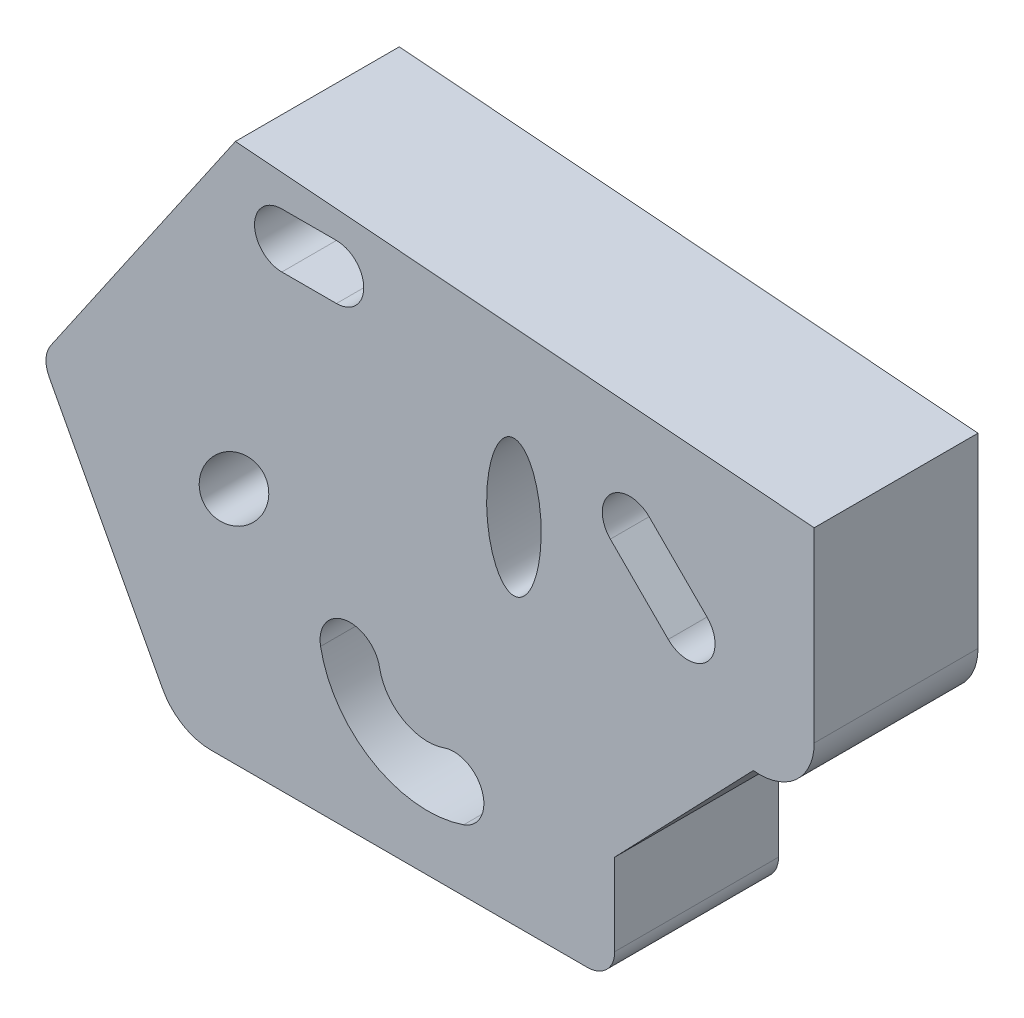
ISO-10303-21;
HEADER;
FILE_DESCRIPTION(('STEP AP214'),'2;1');
FILE_NAME('part.step','',(''),(''),'','','');
FILE_SCHEMA(('AUTOMOTIVE_DESIGN { 1 0 10303 214 1 1 1 1 }'));
ENDSEC;
DATA;
#1=APPLICATION_CONTEXT('core data for automotive mechanical design processes');
#2=APPLICATION_PROTOCOL_DEFINITION('international standard','automotive_design',2000,#1);
#3=PRODUCT_CONTEXT('',#1,'mechanical');
#4=PRODUCT('Part','Part','',(#3));
#5=PRODUCT_RELATED_PRODUCT_CATEGORY('part','',(#4));
#6=PRODUCT_DEFINITION_FORMATION('','',#4);
#7=PRODUCT_DEFINITION_CONTEXT('part definition',#1,'design');
#8=PRODUCT_DEFINITION('design','',#6,#7);
#9=PRODUCT_DEFINITION_SHAPE('','',#8);
#10=(LENGTH_UNIT() NAMED_UNIT(*) SI_UNIT(.MILLI.,.METRE.));
#11=(NAMED_UNIT(*) PLANE_ANGLE_UNIT() SI_UNIT($,.RADIAN.));
#12=(NAMED_UNIT(*) SI_UNIT($,.STERADIAN.) SOLID_ANGLE_UNIT());
#13=UNCERTAINTY_MEASURE_WITH_UNIT(LENGTH_MEASURE(1.E-05),#10,'distance_accuracy_value','');
#14=(GEOMETRIC_REPRESENTATION_CONTEXT(3) GLOBAL_UNCERTAINTY_ASSIGNED_CONTEXT((#13)) GLOBAL_UNIT_ASSIGNED_CONTEXT((#10,
#11,#12)) REPRESENTATION_CONTEXT('',''));
#15=CARTESIAN_POINT('',(0.,0.,0.));
#16=DIRECTION('',(0.,0.,1.));
#17=DIRECTION('',(1.,0.,0.));
#18=AXIS2_PLACEMENT_3D('',#15,#16,#17);
#19=CARTESIAN_POINT('',(192.,-84.8497782754737,0.));
#20=DIRECTION('',(0.,0.,-1.));
#21=DIRECTION('',(-1.,0.,0.));
#22=AXIS2_PLACEMENT_3D('',#19,#20,#21);
#23=PLANE('',#22);
#24=CARTESIAN_POINT('',(70.4570944777884,-137.244425918757,0.));
#25=DIRECTION('',(0.,0.,1.));
#26=DIRECTION('',(1.,0.,0.));
#27=AXIS2_PLACEMENT_3D('',#24,#25,#26);
#28=CIRCLE('',#27,17.9528625932525);
#29=CARTESIAN_POINT('',(52.8116438658685,-140.552499073102,0.));
#30=VERTEX_POINT('',#29);
#31=CARTESIAN_POINT('',(76.3743840386687,-154.194085488934,0.));
#32=VERTEX_POINT('',#31);
#33=EDGE_CURVE('E958',#30,#32,#28,.T.);
#34=ORIENTED_EDGE('',*,*,#33,.F.);
#35=CARTESIAN_POINT('',(42.,-142.579407289482,0.));
#36=DIRECTION('',(0.,0.,1.));
#37=DIRECTION('',(1.,0.,0.));
#38=AXIS2_PLACEMENT_3D('',#35,#36,#37);
#39=CIRCLE('',#38,11.);
#40=CARTESIAN_POINT('',(31.1883561341315,-144.606315505862,0.));
#41=VERTEX_POINT('',#40);
#42=EDGE_CURVE('E266',#30,#41,#39,.T.);
#43=ORIENTED_EDGE('',*,*,#42,.T.);
#44=CARTESIAN_POINT('',(70.4570944777884,-137.244425918757,0.));
#45=DIRECTION('',(0.,0.,1.));
#46=DIRECTION('',(1.,0.,0.));
#47=AXIS2_PLACEMENT_3D('',#44,#45,#46);
#48=CIRCLE('',#47,39.9528625932525);
#49=CARTESIAN_POINT('',(83.6256159613313,-174.96472909003,0.));
#50=VERTEX_POINT('',#49);
#51=EDGE_CURVE('E413',#41,#50,#48,.T.);
#52=ORIENTED_EDGE('',*,*,#51,.T.);
#53=CARTESIAN_POINT('',(80.,-164.579407289482,0.));
#54=DIRECTION('',(0.,0.,1.));
#55=DIRECTION('',(1.,0.,0.));
#56=AXIS2_PLACEMENT_3D('',#53,#54,#55);
#57=CIRCLE('',#56,11.);
#58=EDGE_CURVE('E962',#50,#32,#57,.T.);
#59=ORIENTED_EDGE('',*,*,#58,.T.);
#60=EDGE_LOOP('',(#34,#43,#52,#59));
#61=FACE_BOUND('',#60,.T.);
#62=DIRECTION('',(0.70710678118655,-0.707106781186545,0.));
#63=VECTOR('',#62,1.);
#64=CARTESIAN_POINT('',(151.527534094166,-43.2927201392493,0.));
#65=LINE('',#64,#63);
#66=CARTESIAN_POINT('',(151.527534094166,-43.2927201392493,0.));
#67=VERTEX_POINT('',#66);
#68=CARTESIAN_POINT('',(172.740737529763,-64.5059235748457,0.));
#69=VERTEX_POINT('',#68);
#70=EDGE_CURVE('E931',#67,#69,#65,.T.);
#71=ORIENTED_EDGE('',*,*,#70,.F.);
#72=CARTESIAN_POINT('',(144.426406871193,-50.3938473622226,0.));
#73=DIRECTION('',(0.,0.,1.));
#74=DIRECTION('',(1.,0.,0.));
#75=AXIS2_PLACEMENT_3D('',#72,#73,#74);
#76=CIRCLE('',#75,10.0425104268655);
#77=CARTESIAN_POINT('',(137.32527964822,-57.4949745851957,0.));
#78=VERTEX_POINT('',#77);
#79=EDGE_CURVE('E274',#67,#78,#76,.T.);
#80=ORIENTED_EDGE('',*,*,#79,.T.);
#81=DIRECTION('',(0.707106781186549,-0.707106781186546,0.));
#82=VECTOR('',#81,1.);
#83=CARTESIAN_POINT('',(137.32527964822,-57.4949745851957,0.));
#84=LINE('',#83,#82);
#85=CARTESIAN_POINT('',(158.538483083816,-78.7081780207921,0.));
#86=VERTEX_POINT('',#85);
#87=EDGE_CURVE('E941',#78,#86,#84,.T.);
#88=ORIENTED_EDGE('',*,*,#87,.T.);
#89=CARTESIAN_POINT('',(165.639610306789,-71.6070507978189,0.));
#90=DIRECTION('',(0.,0.,1.));
#91=DIRECTION('',(1.,0.,0.));
#92=AXIS2_PLACEMENT_3D('',#89,#90,#91);
#93=CIRCLE('',#92,10.0425104268655);
#94=EDGE_CURVE('E938',#86,#69,#93,.T.);
#95=ORIENTED_EDGE('',*,*,#94,.T.);
#96=EDGE_LOOP('',(#71,#80,#88,#95));
#97=FACE_BOUND('',#96,.T.);
#98=CARTESIAN_POINT('',(102.,-68.1502074204967,0.));
#99=DIRECTION('',(0.,0.,1.));
#100=DIRECTION('',(0.,-1.,0.));
#101=AXIS2_PLACEMENT_3D('',#98,#99,#100);
#102=ELLIPSE('',#101,25.,9.99999999999999);
#103=CARTESIAN_POINT('',(102.,-93.1502074204967,0.));
#104=VERTEX_POINT('',#103);
#105=EDGE_CURVE('E570',#104,#104,#102,.T.);
#106=ORIENTED_EDGE('',*,*,#105,.T.);
#107=EDGE_LOOP('',(#106));
#108=FACE_BOUND('',#107,.T.);
#109=DIRECTION('',(0.565923248781696,0.824457928877133,0.));
#110=VECTOR('',#109,1.);
#111=CARTESIAN_POINT('',(-67.6368287505263,-98.5358347930092,0.));
#112=LINE('',#111,#110);
#113=CARTESIAN_POINT('',(-67.6368287505263,-98.5358347930092,0.));
#114=VERTEX_POINT('',#113);
#115=CARTESIAN_POINT('',(0.,0.,0.));
#116=VERTEX_POINT('',#115);
#117=EDGE_CURVE('E604',#114,#116,#112,.T.);
#118=ORIENTED_EDGE('',*,*,#117,.T.);
#119=DIRECTION('',(0.996963135149948,-0.077874945598605,0.));
#120=VECTOR('',#119,1.);
#121=CARTESIAN_POINT('',(0.,0.,0.));
#122=LINE('',#121,#120);
#123=CARTESIAN_POINT('',(212.,-16.5597782754737,0.));
#124=VERTEX_POINT('',#123);
#125=EDGE_CURVE('E608',#116,#124,#122,.T.);
#126=ORIENTED_EDGE('',*,*,#125,.T.);
#127=DIRECTION('',(0.,-1.,0.));
#128=VECTOR('',#127,1.);
#129=CARTESIAN_POINT('',(212.,-16.5597782754737,0.));
#130=LINE('',#129,#128);
#131=CARTESIAN_POINT('',(212.,-84.8497782754737,0.));
#132=VERTEX_POINT('',#131);
#133=EDGE_CURVE('E612',#124,#132,#130,.T.);
#134=ORIENTED_EDGE('',*,*,#133,.T.);
#135=CARTESIAN_POINT('',(192.,-84.8497782754737,0.));
#136=DIRECTION('',(0.,0.,-1.));
#137=DIRECTION('',(-1.,0.,0.));
#138=AXIS2_PLACEMENT_3D('',#135,#136,#137);
#139=CIRCLE('',#138,20.0000000000001);
#140=CARTESIAN_POINT('',(189.699474867549,-104.717027307863,0.));
#141=VERTEX_POINT('',#140);
#142=EDGE_CURVE('E616',#132,#141,#139,.T.);
#143=ORIENTED_EDGE('',*,*,#142,.T.);
#144=DIRECTION('',(-0.692646888854,-0.721276845157859,0.));
#145=VECTOR('',#144,1.);
#146=CARTESIAN_POINT('',(189.699474867549,-104.717027307863,0.));
#147=LINE('',#146,#145);
#148=CARTESIAN_POINT('',(138.935384383439,-157.579407289482,0.));
#149=VERTEX_POINT('',#148);
#150=EDGE_CURVE('E620',#141,#149,#147,.T.);
#151=ORIENTED_EDGE('',*,*,#150,.T.);
#152=DIRECTION('',(0.,-1.,0.));
#153=VECTOR('',#152,1.);
#154=CARTESIAN_POINT('',(138.935384383439,-157.579407289482,0.));
#155=LINE('',#154,#153);
#156=CARTESIAN_POINT('',(138.935384383439,-187.579407289482,0.));
#157=VERTEX_POINT('',#156);
#158=EDGE_CURVE('E624',#149,#157,#155,.T.);
#159=ORIENTED_EDGE('',*,*,#158,.T.);
#160=CARTESIAN_POINT('',(128.935384383439,-187.579407289482,0.));
#161=DIRECTION('',(0.,0.,1.));
#162=DIRECTION('',(1.,0.,0.));
#163=AXIS2_PLACEMENT_3D('',#160,#161,#162);
#164=CIRCLE('',#163,10.);
#165=CARTESIAN_POINT('',(128.935384383439,-197.579407289482,0.));
#166=VERTEX_POINT('',#165);
#167=EDGE_CURVE('E628',#166,#157,#164,.T.);
#168=ORIENTED_EDGE('',*,*,#167,.F.);
#169=DIRECTION('',(-1.,0.,0.));
#170=VECTOR('',#169,1.);
#171=CARTESIAN_POINT('',(128.935384383439,-197.579407289482,0.));
#172=LINE('',#171,#170);
#173=CARTESIAN_POINT('',(-9.04740323600958,-197.579407289482,0.));
#174=VERTEX_POINT('',#173);
#175=EDGE_CURVE('E632',#166,#174,#172,.T.);
#176=ORIENTED_EDGE('',*,*,#175,.T.);
#177=CARTESIAN_POINT('',(-9.04740323600958,-177.579407289482,0.));
#178=DIRECTION('',(0.,0.,-1.));
#179=DIRECTION('',(-1.,0.,0.));
#180=AXIS2_PLACEMENT_3D('',#177,#178,#179);
#181=CIRCLE('',#180,20.);
#182=CARTESIAN_POINT('',(-26.7063550931881,-186.9688385452,0.));
#183=VERTEX_POINT('',#182);
#184=EDGE_CURVE('E636',#174,#183,#181,.T.);
#185=ORIENTED_EDGE('',*,*,#184,.T.);
#186=DIRECTION('',(-0.469471562785889,0.882947592858928,0.));
#187=VECTOR('',#186,1.);
#188=CARTESIAN_POINT('',(-26.7063550931881,-186.9688385452,0.));
#189=LINE('',#188,#187);
#190=CARTESIAN_POINT('',(-68.2217253903443,-108.889782908685,0.));
#191=VERTEX_POINT('',#190);
#192=EDGE_CURVE('E640',#183,#191,#189,.T.);
#193=ORIENTED_EDGE('',*,*,#192,.T.);
#194=CARTESIAN_POINT('',(-59.392249461755,-104.195067280826,0.));
#195=DIRECTION('',(0.,0.,-1.));
#196=DIRECTION('',(-1.,0.,0.));
#197=AXIS2_PLACEMENT_3D('',#194,#195,#196);
#198=CIRCLE('',#197,9.99999999999999);
#199=EDGE_CURVE('E644',#191,#114,#198,.T.);
#200=ORIENTED_EDGE('',*,*,#199,.T.);
#201=EDGE_LOOP('',(#118,#126,#134,#143,#151,#159,#168,#176,#185,#193,#200));
#202=FACE_BOUND('',#201,.T.);
#203=DIRECTION('',(1.,0.,0.));
#204=VECTOR('',#203,1.);
#205=CARTESIAN_POINT('',(17.,-12.9206111369514,0.));
#206=LINE('',#205,#204);
#207=CARTESIAN_POINT('',(17.,-12.9206111369514,0.));
#208=VERTEX_POINT('',#207);
#209=CARTESIAN_POINT('',(37.,-12.9206111369514,0.));
#210=VERTEX_POINT('',#209);
#211=EDGE_CURVE('E586',#208,#210,#206,.T.);
#212=ORIENTED_EDGE('',*,*,#211,.F.);
#213=CARTESIAN_POINT('',(17.,-22.9206111369514,0.));
#214=DIRECTION('',(0.,0.,1.));
#215=DIRECTION('',(1.,0.,0.));
#216=AXIS2_PLACEMENT_3D('',#213,#214,#215);
#217=CIRCLE('',#216,10.);
#218=CARTESIAN_POINT('',(17.,-32.9206111369514,0.));
#219=VERTEX_POINT('',#218);
#220=EDGE_CURVE('E574',#208,#219,#217,.T.);
#221=ORIENTED_EDGE('',*,*,#220,.T.);
#222=DIRECTION('',(1.,0.,0.));
#223=VECTOR('',#222,1.);
#224=CARTESIAN_POINT('',(17.,-32.9206111369514,0.));
#225=LINE('',#224,#223);
#226=CARTESIAN_POINT('',(37.,-32.9206111369514,0.));
#227=VERTEX_POINT('',#226);
#228=EDGE_CURVE('E578',#219,#227,#225,.T.);
#229=ORIENTED_EDGE('',*,*,#228,.T.);
#230=CARTESIAN_POINT('',(37.,-22.9206111369514,0.));
#231=DIRECTION('',(0.,0.,1.));
#232=DIRECTION('',(1.,0.,0.));
#233=AXIS2_PLACEMENT_3D('',#230,#231,#232);
#234=CIRCLE('',#233,10.);
#235=EDGE_CURVE('E582',#227,#210,#234,.T.);
#236=ORIENTED_EDGE('',*,*,#235,.T.);
#237=EDGE_LOOP('',(#212,#221,#229,#236));
#238=FACE_BOUND('',#237,.T.);
#239=CARTESIAN_POINT('',(-0.530483272049562,-110.497923763079,0.));
#240=DIRECTION('',(0.,0.,1.));
#241=DIRECTION('',(0.707106781186549,0.707106781186546,0.));
#242=AXIS2_PLACEMENT_3D('',#239,#240,#241);
#243=ELLIPSE('',#242,15.,10.);
#244=CARTESIAN_POINT('',(10.0761184457487,-99.8913220452808,0.));
#245=VERTEX_POINT('',#244);
#246=EDGE_CURVE('E521',#245,#245,#243,.T.);
#247=ORIENTED_EDGE('',*,*,#246,.T.);
#248=EDGE_LOOP('',(#247));
#249=FACE_BOUND('',#248,.T.);
#250=ADVANCED_FACE('F248',(#61,#97,#108,#202,#238,#249),#23,.T.);
#251=CARTESIAN_POINT('',(-67.6368287505263,-98.5358347930092,10.));
#252=DIRECTION('',(-0.824457928877133,0.565923248781696,0.));
#253=DIRECTION('',(-0.565923248781696,-0.824457928877133,0.));
#254=AXIS2_PLACEMENT_3D('',#251,#252,#253);
#255=PLANE('',#254);
#256=ORIENTED_EDGE('',*,*,#117,.F.);
#257=DIRECTION('',(0.,0.,-1.));
#258=VECTOR('',#257,1.);
#259=CARTESIAN_POINT('',(-67.6368287505263,-98.5358347930092,10.));
#260=LINE('',#259,#258);
#261=CARTESIAN_POINT('',(-67.6368287505263,-98.5358347930092,60.));
#262=VERTEX_POINT('',#261);
#263=EDGE_CURVE('E12',#262,#114,#260,.T.);
#264=ORIENTED_EDGE('',*,*,#263,.F.);
#265=DIRECTION('',(-0.565923248781696,-0.824457928877133,0.));
#266=VECTOR('',#265,1.);
#267=CARTESIAN_POINT('',(-67.6368287505263,-98.5358347930092,60.));
#268=LINE('',#267,#266);
#269=CARTESIAN_POINT('',(0.,0.,60.));
#270=VERTEX_POINT('',#269);
#271=EDGE_CURVE('E477',#270,#262,#268,.T.);
#272=ORIENTED_EDGE('',*,*,#271,.F.);
#273=DIRECTION('',(0.,0.,-1.));
#274=VECTOR('',#273,1.);
#275=CARTESIAN_POINT('',(0.,0.,10.));
#276=LINE('',#275,#274);
#277=EDGE_CURVE('E252',#270,#116,#276,.T.);
#278=ORIENTED_EDGE('',*,*,#277,.T.);
#279=EDGE_LOOP('',(#256,#264,#272,#278));
#280=FACE_BOUND('',#279,.T.);
#281=ADVANCED_FACE('F250',(#280),#255,.T.);
#282=CARTESIAN_POINT('',(-59.392249461755,-104.195067280826,10.));
#283=DIRECTION('',(0.,0.,-1.));
#284=DIRECTION('',(-1.,0.,0.));
#285=AXIS2_PLACEMENT_3D('',#282,#283,#284);
#286=CYLINDRICAL_SURFACE('',#285,9.99999999999999);
#287=ORIENTED_EDGE('',*,*,#199,.F.);
#288=DIRECTION('',(0.,0.,-1.));
#289=VECTOR('',#288,1.);
#290=CARTESIAN_POINT('',(-68.2217253903443,-108.889782908685,10.));
#291=LINE('',#290,#289);
#292=CARTESIAN_POINT('',(-68.2217253903443,-108.889782908685,60.));
#293=VERTEX_POINT('',#292);
#294=EDGE_CURVE('E258',#293,#191,#291,.T.);
#295=ORIENTED_EDGE('',*,*,#294,.F.);
#296=CARTESIAN_POINT('',(-59.392249461755,-104.195067280826,60.));
#297=DIRECTION('',(0.,0.,1.));
#298=DIRECTION('',(-1.,0.,0.));
#299=AXIS2_PLACEMENT_3D('',#296,#297,#298);
#300=CIRCLE('',#299,9.99999999999999);
#301=EDGE_CURVE('E481',#262,#293,#300,.T.);
#302=ORIENTED_EDGE('',*,*,#301,.F.);
#303=ORIENTED_EDGE('',*,*,#263,.T.);
#304=EDGE_LOOP('',(#287,#295,#302,#303));
#305=FACE_BOUND('',#304,.T.);
#306=ADVANCED_FACE('F686',(#305),#286,.T.);
#307=CARTESIAN_POINT('',(-26.7063550931881,-186.9688385452,10.));
#308=DIRECTION('',(-0.882947592858928,-0.469471562785889,0.));
#309=DIRECTION('',(0.469471562785889,-0.882947592858928,0.));
#310=AXIS2_PLACEMENT_3D('',#307,#308,#309);
#311=PLANE('',#310);
#312=ORIENTED_EDGE('',*,*,#192,.F.);
#313=DIRECTION('',(0.,0.,-1.));
#314=VECTOR('',#313,1.);
#315=CARTESIAN_POINT('',(-26.7063550931881,-186.9688385452,10.));
#316=LINE('',#315,#314);
#317=CARTESIAN_POINT('',(-26.7063550931881,-186.9688385452,60.));
#318=VERTEX_POINT('',#317);
#319=EDGE_CURVE('E650',#318,#183,#316,.T.);
#320=ORIENTED_EDGE('',*,*,#319,.F.);
#321=DIRECTION('',(0.469471562785889,-0.882947592858928,0.));
#322=VECTOR('',#321,1.);
#323=CARTESIAN_POINT('',(-26.7063550931881,-186.9688385452,60.));
#324=LINE('',#323,#322);
#325=EDGE_CURVE('E485',#293,#318,#324,.T.);
#326=ORIENTED_EDGE('',*,*,#325,.F.);
#327=ORIENTED_EDGE('',*,*,#294,.T.);
#328=EDGE_LOOP('',(#312,#320,#326,#327));
#329=FACE_BOUND('',#328,.T.);
#330=ADVANCED_FACE('F717',(#329),#311,.T.);
#331=CARTESIAN_POINT('',(-9.04740323600958,-177.579407289482,10.));
#332=DIRECTION('',(0.,0.,-1.));
#333=DIRECTION('',(-1.,0.,0.));
#334=AXIS2_PLACEMENT_3D('',#331,#332,#333);
#335=CYLINDRICAL_SURFACE('',#334,20.);
#336=ORIENTED_EDGE('',*,*,#184,.F.);
#337=DIRECTION('',(0.,0.,-1.));
#338=VECTOR('',#337,1.);
#339=CARTESIAN_POINT('',(-9.04740323600958,-197.579407289482,10.));
#340=LINE('',#339,#338);
#341=CARTESIAN_POINT('',(-9.04740323600958,-197.579407289482,60.));
#342=VERTEX_POINT('',#341);
#343=EDGE_CURVE('E653',#342,#174,#340,.T.);
#344=ORIENTED_EDGE('',*,*,#343,.F.);
#345=CARTESIAN_POINT('',(-9.04740323600958,-177.579407289482,60.));
#346=DIRECTION('',(0.,0.,1.));
#347=DIRECTION('',(-1.,0.,0.));
#348=AXIS2_PLACEMENT_3D('',#345,#346,#347);
#349=CIRCLE('',#348,20.);
#350=EDGE_CURVE('E489',#318,#342,#349,.T.);
#351=ORIENTED_EDGE('',*,*,#350,.F.);
#352=ORIENTED_EDGE('',*,*,#319,.T.);
#353=EDGE_LOOP('',(#336,#344,#351,#352));
#354=FACE_BOUND('',#353,.T.);
#355=ADVANCED_FACE('F715',(#354),#335,.T.);
#356=CARTESIAN_POINT('',(128.935384383439,-197.579407289482,10.));
#357=DIRECTION('',(0.,-1.,0.));
#358=DIRECTION('',(0.,0.,-1.));
#359=AXIS2_PLACEMENT_3D('',#356,#357,#358);
#360=PLANE('',#359);
#361=ORIENTED_EDGE('',*,*,#175,.F.);
#362=DIRECTION('',(0.,0.,-1.));
#363=VECTOR('',#362,1.);
#364=CARTESIAN_POINT('',(128.935384383439,-197.579407289482,10.));
#365=LINE('',#364,#363);
#366=CARTESIAN_POINT('',(128.935384383439,-197.579407289482,60.));
#367=VERTEX_POINT('',#366);
#368=EDGE_CURVE('E656',#367,#166,#365,.T.);
#369=ORIENTED_EDGE('',*,*,#368,.F.);
#370=DIRECTION('',(1.,0.,0.));
#371=VECTOR('',#370,1.);
#372=CARTESIAN_POINT('',(128.935384383439,-197.579407289482,60.));
#373=LINE('',#372,#371);
#374=EDGE_CURVE('E493',#342,#367,#373,.T.);
#375=ORIENTED_EDGE('',*,*,#374,.F.);
#376=ORIENTED_EDGE('',*,*,#343,.T.);
#377=EDGE_LOOP('',(#361,#369,#375,#376));
#378=FACE_BOUND('',#377,.T.);
#379=ADVANCED_FACE('F710',(#378),#360,.T.);
#380=CARTESIAN_POINT('',(128.935384383439,-187.579407289482,10.));
#381=DIRECTION('',(0.,0.,-1.));
#382=DIRECTION('',(-1.,0.,0.));
#383=AXIS2_PLACEMENT_3D('',#380,#381,#382);
#384=CYLINDRICAL_SURFACE('',#383,10.);
#385=ORIENTED_EDGE('',*,*,#167,.T.);
#386=DIRECTION('',(0.,0.,-1.));
#387=VECTOR('',#386,1.);
#388=CARTESIAN_POINT('',(138.935384383439,-187.579407289482,10.));
#389=LINE('',#388,#387);
#390=CARTESIAN_POINT('',(138.935384383439,-187.579407289482,60.));
#391=VERTEX_POINT('',#390);
#392=EDGE_CURVE('E659',#391,#157,#389,.T.);
#393=ORIENTED_EDGE('',*,*,#392,.F.);
#394=CARTESIAN_POINT('',(128.935384383439,-187.579407289482,60.));
#395=DIRECTION('',(0.,0.,1.));
#396=DIRECTION('',(1.,0.,0.));
#397=AXIS2_PLACEMENT_3D('',#394,#395,#396);
#398=CIRCLE('',#397,10.);
#399=EDGE_CURVE('E497',#367,#391,#398,.T.);
#400=ORIENTED_EDGE('',*,*,#399,.F.);
#401=ORIENTED_EDGE('',*,*,#368,.T.);
#402=EDGE_LOOP('',(#385,#393,#400,#401));
#403=FACE_BOUND('',#402,.T.);
#404=ADVANCED_FACE('F719',(#403),#384,.T.);
#405=CARTESIAN_POINT('',(138.935384383439,-157.579407289482,10.));
#406=DIRECTION('',(1.,0.,0.));
#407=DIRECTION('',(0.,0.,-1.));
#408=AXIS2_PLACEMENT_3D('',#405,#406,#407);
#409=PLANE('',#408);
#410=ORIENTED_EDGE('',*,*,#158,.F.);
#411=DIRECTION('',(0.,0.,-1.));
#412=VECTOR('',#411,1.);
#413=CARTESIAN_POINT('',(138.935384383439,-157.579407289482,10.));
#414=LINE('',#413,#412);
#415=CARTESIAN_POINT('',(138.935384383439,-157.579407289482,60.));
#416=VERTEX_POINT('',#415);
#417=EDGE_CURVE('E662',#416,#149,#414,.T.);
#418=ORIENTED_EDGE('',*,*,#417,.F.);
#419=DIRECTION('',(0.,1.,0.));
#420=VECTOR('',#419,1.);
#421=CARTESIAN_POINT('',(138.935384383439,-157.579407289482,60.));
#422=LINE('',#421,#420);
#423=EDGE_CURVE('E501',#391,#416,#422,.T.);
#424=ORIENTED_EDGE('',*,*,#423,.F.);
#425=ORIENTED_EDGE('',*,*,#392,.T.);
#426=EDGE_LOOP('',(#410,#418,#424,#425));
#427=FACE_BOUND('',#426,.T.);
#428=ADVANCED_FACE('F705',(#427),#409,.T.);
#429=CARTESIAN_POINT('',(189.699474867549,-104.717027307863,10.));
#430=DIRECTION('',(0.721276845157859,-0.692646888854,0.));
#431=DIRECTION('',(0.692646888854,0.721276845157859,0.));
#432=AXIS2_PLACEMENT_3D('',#429,#430,#431);
#433=PLANE('',#432);
#434=ORIENTED_EDGE('',*,*,#150,.F.);
#435=DIRECTION('',(0.,0.,-1.));
#436=VECTOR('',#435,1.);
#437=CARTESIAN_POINT('',(189.699474867549,-104.717027307863,10.));
#438=LINE('',#437,#436);
#439=CARTESIAN_POINT('',(189.699474867549,-104.717027307863,60.));
#440=VERTEX_POINT('',#439);
#441=EDGE_CURVE('E665',#440,#141,#438,.T.);
#442=ORIENTED_EDGE('',*,*,#441,.F.);
#443=DIRECTION('',(0.692646888854,0.721276845157859,0.));
#444=VECTOR('',#443,1.);
#445=CARTESIAN_POINT('',(189.699474867549,-104.717027307863,60.));
#446=LINE('',#445,#444);
#447=EDGE_CURVE('E505',#416,#440,#446,.T.);
#448=ORIENTED_EDGE('',*,*,#447,.F.);
#449=ORIENTED_EDGE('',*,*,#417,.T.);
#450=EDGE_LOOP('',(#434,#442,#448,#449));
#451=FACE_BOUND('',#450,.T.);
#452=ADVANCED_FACE('F701',(#451),#433,.T.);
#453=CARTESIAN_POINT('',(192.,-84.8497782754737,10.));
#454=DIRECTION('',(0.,0.,-1.));
#455=DIRECTION('',(-1.,0.,0.));
#456=AXIS2_PLACEMENT_3D('',#453,#454,#455);
#457=CYLINDRICAL_SURFACE('',#456,20.0000000000001);
#458=ORIENTED_EDGE('',*,*,#142,.F.);
#459=DIRECTION('',(0.,0.,-1.));
#460=VECTOR('',#459,1.);
#461=CARTESIAN_POINT('',(212.,-84.8497782754737,10.));
#462=LINE('',#461,#460);
#463=CARTESIAN_POINT('',(212.,-84.8497782754737,60.));
#464=VERTEX_POINT('',#463);
#465=EDGE_CURVE('E668',#464,#132,#462,.T.);
#466=ORIENTED_EDGE('',*,*,#465,.F.);
#467=CARTESIAN_POINT('',(192.,-84.8497782754737,60.));
#468=DIRECTION('',(0.,0.,1.));
#469=DIRECTION('',(-1.,0.,0.));
#470=AXIS2_PLACEMENT_3D('',#467,#468,#469);
#471=CIRCLE('',#470,20.0000000000001);
#472=EDGE_CURVE('E509',#440,#464,#471,.T.);
#473=ORIENTED_EDGE('',*,*,#472,.F.);
#474=ORIENTED_EDGE('',*,*,#441,.T.);
#475=EDGE_LOOP('',(#458,#466,#473,#474));
#476=FACE_BOUND('',#475,.T.);
#477=ADVANCED_FACE('F698',(#476),#457,.T.);
#478=CARTESIAN_POINT('',(212.,-16.5597782754737,10.));
#479=DIRECTION('',(1.,0.,0.));
#480=DIRECTION('',(0.,0.,-1.));
#481=AXIS2_PLACEMENT_3D('',#478,#479,#480);
#482=PLANE('',#481);
#483=ORIENTED_EDGE('',*,*,#133,.F.);
#484=DIRECTION('',(0.,0.,-1.));
#485=VECTOR('',#484,1.);
#486=CARTESIAN_POINT('',(212.,-16.5597782754737,10.));
#487=LINE('',#486,#485);
#488=CARTESIAN_POINT('',(212.,-16.5597782754737,60.));
#489=VERTEX_POINT('',#488);
#490=EDGE_CURVE('E670',#489,#124,#487,.T.);
#491=ORIENTED_EDGE('',*,*,#490,.F.);
#492=DIRECTION('',(0.,1.,0.));
#493=VECTOR('',#492,1.);
#494=CARTESIAN_POINT('',(212.,-16.5597782754737,60.));
#495=LINE('',#494,#493);
#496=EDGE_CURVE('E513',#464,#489,#495,.T.);
#497=ORIENTED_EDGE('',*,*,#496,.F.);
#498=ORIENTED_EDGE('',*,*,#465,.T.);
#499=EDGE_LOOP('',(#483,#491,#497,#498));
#500=FACE_BOUND('',#499,.T.);
#501=ADVANCED_FACE('F694',(#500),#482,.T.);
#502=CARTESIAN_POINT('',(0.,0.,10.));
#503=DIRECTION('',(0.077874945598605,0.996963135149948,0.));
#504=DIRECTION('',(-0.996963135149948,0.077874945598605,0.));
#505=AXIS2_PLACEMENT_3D('',#502,#503,#504);
#506=PLANE('',#505);
#507=ORIENTED_EDGE('',*,*,#125,.F.);
#508=ORIENTED_EDGE('',*,*,#277,.F.);
#509=DIRECTION('',(-0.996963135149948,0.077874945598605,0.));
#510=VECTOR('',#509,1.);
#511=CARTESIAN_POINT('',(0.,0.,60.));
#512=LINE('',#511,#510);
#513=EDGE_CURVE('E517',#489,#270,#512,.T.);
#514=ORIENTED_EDGE('',*,*,#513,.F.);
#515=ORIENTED_EDGE('',*,*,#490,.T.);
#516=EDGE_LOOP('',(#507,#508,#514,#515));
#517=FACE_BOUND('',#516,.T.);
#518=ADVANCED_FACE('F680',(#517),#506,.T.);
#519=CARTESIAN_POINT('',(17.,-22.9206111369514,10.));
#520=DIRECTION('',(0.,0.,-1.));
#521=DIRECTION('',(-1.,0.,0.));
#522=AXIS2_PLACEMENT_3D('',#519,#520,#521);
#523=CYLINDRICAL_SURFACE('',#522,10.);
#524=ORIENTED_EDGE('',*,*,#220,.F.);
#525=DIRECTION('',(0.,0.,-1.));
#526=VECTOR('',#525,1.);
#527=CARTESIAN_POINT('',(17.,-12.9206111369514,10.));
#528=LINE('',#527,#526);
#529=CARTESIAN_POINT('',(17.,-12.9206111369514,60.));
#530=VERTEX_POINT('',#529);
#531=EDGE_CURVE('E590',#530,#208,#528,.T.);
#532=ORIENTED_EDGE('',*,*,#531,.F.);
#533=CARTESIAN_POINT('',(17.,-22.9206111369514,60.));
#534=DIRECTION('',(0.,0.,1.));
#535=DIRECTION('',(1.,0.,0.));
#536=AXIS2_PLACEMENT_3D('',#533,#534,#535);
#537=CIRCLE('',#536,10.);
#538=CARTESIAN_POINT('',(17.,-32.9206111369514,60.));
#539=VERTEX_POINT('',#538);
#540=EDGE_CURVE('E461',#530,#539,#537,.T.);
#541=ORIENTED_EDGE('',*,*,#540,.T.);
#542=DIRECTION('',(0.,0.,-1.));
#543=VECTOR('',#542,1.);
#544=CARTESIAN_POINT('',(17.,-32.9206111369514,10.));
#545=LINE('',#544,#543);
#546=EDGE_CURVE('E600',#539,#219,#545,.T.);
#547=ORIENTED_EDGE('',*,*,#546,.T.);
#548=EDGE_LOOP('',(#524,#532,#541,#547));
#549=FACE_BOUND('',#548,.T.);
#550=ADVANCED_FACE('F738',(#549),#523,.F.);
#551=CARTESIAN_POINT('',(17.,-32.9206111369514,10.));
#552=DIRECTION('',(0.,1.,0.));
#553=DIRECTION('',(0.,0.,1.));
#554=AXIS2_PLACEMENT_3D('',#551,#552,#553);
#555=PLANE('',#554);
#556=ORIENTED_EDGE('',*,*,#228,.F.);
#557=ORIENTED_EDGE('',*,*,#546,.F.);
#558=DIRECTION('',(1.,0.,0.));
#559=VECTOR('',#558,1.);
#560=CARTESIAN_POINT('',(17.,-32.9206111369514,60.));
#561=LINE('',#560,#559);
#562=CARTESIAN_POINT('',(37.,-32.9206111369514,60.));
#563=VERTEX_POINT('',#562);
#564=EDGE_CURVE('E465',#539,#563,#561,.T.);
#565=ORIENTED_EDGE('',*,*,#564,.T.);
#566=DIRECTION('',(0.,0.,-1.));
#567=VECTOR('',#566,1.);
#568=CARTESIAN_POINT('',(37.,-32.9206111369514,10.));
#569=LINE('',#568,#567);
#570=EDGE_CURVE('E597',#563,#227,#569,.T.);
#571=ORIENTED_EDGE('',*,*,#570,.T.);
#572=EDGE_LOOP('',(#556,#557,#565,#571));
#573=FACE_BOUND('',#572,.T.);
#574=ADVANCED_FACE('F810',(#573),#555,.T.);
#575=CARTESIAN_POINT('',(37.,-22.9206111369514,10.));
#576=DIRECTION('',(0.,0.,-1.));
#577=DIRECTION('',(-1.,0.,0.));
#578=AXIS2_PLACEMENT_3D('',#575,#576,#577);
#579=CYLINDRICAL_SURFACE('',#578,10.);
#580=ORIENTED_EDGE('',*,*,#235,.F.);
#581=ORIENTED_EDGE('',*,*,#570,.F.);
#582=CARTESIAN_POINT('',(37.,-22.9206111369514,60.));
#583=DIRECTION('',(0.,0.,1.));
#584=DIRECTION('',(1.,0.,0.));
#585=AXIS2_PLACEMENT_3D('',#582,#583,#584);
#586=CIRCLE('',#585,10.);
#587=CARTESIAN_POINT('',(37.,-12.9206111369514,60.));
#588=VERTEX_POINT('',#587);
#589=EDGE_CURVE('E469',#563,#588,#586,.T.);
#590=ORIENTED_EDGE('',*,*,#589,.T.);
#591=DIRECTION('',(0.,0.,-1.));
#592=VECTOR('',#591,1.);
#593=CARTESIAN_POINT('',(37.,-12.9206111369514,10.));
#594=LINE('',#593,#592);
#595=EDGE_CURVE('E594',#588,#210,#594,.T.);
#596=ORIENTED_EDGE('',*,*,#595,.T.);
#597=EDGE_LOOP('',(#580,#581,#590,#596));
#598=FACE_BOUND('',#597,.T.);
#599=ADVANCED_FACE('F820',(#598),#579,.F.);
#600=CARTESIAN_POINT('',(17.,-12.9206111369514,10.));
#601=DIRECTION('',(0.,1.,0.));
#602=DIRECTION('',(-1.,0.,0.));
#603=AXIS2_PLACEMENT_3D('',#600,#601,#602);
#604=PLANE('',#603);
#605=ORIENTED_EDGE('',*,*,#211,.T.);
#606=ORIENTED_EDGE('',*,*,#595,.F.);
#607=DIRECTION('',(-1.,0.,0.));
#608=VECTOR('',#607,1.);
#609=CARTESIAN_POINT('',(17.,-12.9206111369514,60.));
#610=LINE('',#609,#608);
#611=EDGE_CURVE('E473',#588,#530,#610,.T.);
#612=ORIENTED_EDGE('',*,*,#611,.T.);
#613=ORIENTED_EDGE('',*,*,#531,.T.);
#614=EDGE_LOOP('',(#605,#606,#612,#613));
#615=FACE_BOUND('',#614,.T.);
#616=ADVANCED_FACE('F562',(#615),#604,.F.);
#617=CARTESIAN_POINT('',(102.,-68.1502074204967,10.));
#618=DIRECTION('',(0.,0.,1.));
#619=DIRECTION('',(0.,-1.,0.));
#620=AXIS2_PLACEMENT_3D('',#617,#618,#619);
#621=ELLIPSE('',#620,25.,9.99999999999999);
#622=DIRECTION('',(0.,0.,-1.));
#623=VECTOR('',#622,1.);
#624=SURFACE_OF_LINEAR_EXTRUSION('',#621,#623);
#625=ORIENTED_EDGE('',*,*,#105,.F.);
#626=EDGE_LOOP('',(#625));
#627=FACE_BOUND('',#626,.T.);
#628=CARTESIAN_POINT('',(102.,-68.1502074204967,60.));
#629=DIRECTION('',(0.,0.,1.));
#630=DIRECTION('',(0.,-1.,0.));
#631=AXIS2_PLACEMENT_3D('',#628,#629,#630);
#632=ELLIPSE('',#631,25.,9.99999999999999);
#633=CARTESIAN_POINT('',(102.,-93.1502074204967,60.));
#634=VERTEX_POINT('',#633);
#635=EDGE_CURVE('E453',#634,#634,#632,.T.);
#636=ORIENTED_EDGE('',*,*,#635,.T.);
#637=EDGE_LOOP('',(#636));
#638=FACE_BOUND('',#637,.T.);
#639=ADVANCED_FACE('F558',(#627,#638),#624,.T.);
#640=CARTESIAN_POINT('',(144.426406871193,-50.3938473622226,10.));
#641=DIRECTION('',(0.,0.,-1.));
#642=DIRECTION('',(-1.,0.,0.));
#643=AXIS2_PLACEMENT_3D('',#640,#641,#642);
#644=CYLINDRICAL_SURFACE('',#643,10.0425104268655);
#645=ORIENTED_EDGE('',*,*,#79,.F.);
#646=DIRECTION('',(0.,0.,-1.));
#647=VECTOR('',#646,1.);
#648=CARTESIAN_POINT('',(151.527534094166,-43.2927201392493,10.));
#649=LINE('',#648,#647);
#650=CARTESIAN_POINT('',(151.527534094166,-43.2927201392493,60.));
#651=VERTEX_POINT('',#650);
#652=EDGE_CURVE('E926',#651,#67,#649,.T.);
#653=ORIENTED_EDGE('',*,*,#652,.F.);
#654=CARTESIAN_POINT('',(144.426406871193,-50.3938473622226,60.));
#655=DIRECTION('',(0.,0.,1.));
#656=DIRECTION('',(1.,0.,0.));
#657=AXIS2_PLACEMENT_3D('',#654,#655,#656);
#658=CIRCLE('',#657,10.0425104268655);
#659=CARTESIAN_POINT('',(137.32527964822,-57.4949745851957,60.));
#660=VERTEX_POINT('',#659);
#661=EDGE_CURVE('E437',#651,#660,#658,.T.);
#662=ORIENTED_EDGE('',*,*,#661,.T.);
#663=DIRECTION('',(0.,0.,-1.));
#664=VECTOR('',#663,1.);
#665=CARTESIAN_POINT('',(137.32527964822,-57.4949745851957,10.));
#666=LINE('',#665,#664);
#667=EDGE_CURVE('E568',#660,#78,#666,.T.);
#668=ORIENTED_EDGE('',*,*,#667,.T.);
#669=EDGE_LOOP('',(#645,#653,#662,#668));
#670=FACE_BOUND('',#669,.T.);
#671=ADVANCED_FACE('F554',(#670),#644,.F.);
#672=CARTESIAN_POINT('',(137.32527964822,-57.4949745851957,10.));
#673=DIRECTION('',(0.707106781186546,0.707106781186549,0.));
#674=DIRECTION('',(-0.707106781186549,0.707106781186546,0.));
#675=AXIS2_PLACEMENT_3D('',#672,#673,#674);
#676=PLANE('',#675);
#677=ORIENTED_EDGE('',*,*,#87,.F.);
#678=ORIENTED_EDGE('',*,*,#667,.F.);
#679=DIRECTION('',(0.707106781186549,-0.707106781186546,0.));
#680=VECTOR('',#679,1.);
#681=CARTESIAN_POINT('',(137.32527964822,-57.4949745851957,60.));
#682=LINE('',#681,#680);
#683=CARTESIAN_POINT('',(158.538483083816,-78.7081780207921,60.));
#684=VERTEX_POINT('',#683);
#685=EDGE_CURVE('E441',#660,#684,#682,.T.);
#686=ORIENTED_EDGE('',*,*,#685,.T.);
#687=DIRECTION('',(0.,0.,-1.));
#688=VECTOR('',#687,1.);
#689=CARTESIAN_POINT('',(158.538483083816,-78.7081780207921,10.));
#690=LINE('',#689,#688);
#691=EDGE_CURVE('E936',#684,#86,#690,.T.);
#692=ORIENTED_EDGE('',*,*,#691,.T.);
#693=EDGE_LOOP('',(#677,#678,#686,#692));
#694=FACE_BOUND('',#693,.T.);
#695=ADVANCED_FACE('F550',(#694),#676,.T.);
#696=CARTESIAN_POINT('',(165.639610306789,-71.6070507978189,10.));
#697=DIRECTION('',(0.,0.,-1.));
#698=DIRECTION('',(-1.,0.,0.));
#699=AXIS2_PLACEMENT_3D('',#696,#697,#698);
#700=CYLINDRICAL_SURFACE('',#699,10.0425104268655);
#701=ORIENTED_EDGE('',*,*,#94,.F.);
#702=ORIENTED_EDGE('',*,*,#691,.F.);
#703=CARTESIAN_POINT('',(165.639610306789,-71.6070507978189,60.));
#704=DIRECTION('',(0.,0.,1.));
#705=DIRECTION('',(1.,0.,0.));
#706=AXIS2_PLACEMENT_3D('',#703,#704,#705);
#707=CIRCLE('',#706,10.0425104268655);
#708=CARTESIAN_POINT('',(172.740737529763,-64.5059235748457,60.));
#709=VERTEX_POINT('',#708);
#710=EDGE_CURVE('E445',#684,#709,#707,.T.);
#711=ORIENTED_EDGE('',*,*,#710,.T.);
#712=DIRECTION('',(0.,0.,-1.));
#713=VECTOR('',#712,1.);
#714=CARTESIAN_POINT('',(172.740737529763,-64.5059235748457,10.));
#715=LINE('',#714,#713);
#716=EDGE_CURVE('E930',#709,#69,#715,.T.);
#717=ORIENTED_EDGE('',*,*,#716,.T.);
#718=EDGE_LOOP('',(#701,#702,#711,#717));
#719=FACE_BOUND('',#718,.T.);
#720=ADVANCED_FACE('F546',(#719),#700,.F.);
#721=CARTESIAN_POINT('',(151.527534094166,-43.2927201392493,10.));
#722=DIRECTION('',(0.707106781186545,0.70710678118655,0.));
#723=DIRECTION('',(-0.70710678118655,0.707106781186545,0.));
#724=AXIS2_PLACEMENT_3D('',#721,#722,#723);
#725=PLANE('',#724);
#726=ORIENTED_EDGE('',*,*,#70,.T.);
#727=ORIENTED_EDGE('',*,*,#716,.F.);
#728=DIRECTION('',(-0.70710678118655,0.707106781186545,0.));
#729=VECTOR('',#728,1.);
#730=CARTESIAN_POINT('',(151.527534094166,-43.2927201392493,60.));
#731=LINE('',#730,#729);
#732=EDGE_CURVE('E449',#709,#651,#731,.T.);
#733=ORIENTED_EDGE('',*,*,#732,.T.);
#734=ORIENTED_EDGE('',*,*,#652,.T.);
#735=EDGE_LOOP('',(#726,#727,#733,#734));
#736=FACE_BOUND('',#735,.T.);
#737=ADVANCED_FACE('F543',(#736),#725,.F.);
#738=CARTESIAN_POINT('',(42.,-142.579407289482,10.));
#739=DIRECTION('',(0.,0.,-1.));
#740=DIRECTION('',(-1.,0.,0.));
#741=AXIS2_PLACEMENT_3D('',#738,#739,#740);
#742=CYLINDRICAL_SURFACE('',#741,11.);
#743=ORIENTED_EDGE('',*,*,#42,.F.);
#744=DIRECTION('',(0.,0.,-1.));
#745=VECTOR('',#744,1.);
#746=CARTESIAN_POINT('',(52.8116438658685,-140.552499073102,10.));
#747=LINE('',#746,#745);
#748=CARTESIAN_POINT('',(52.8116438658685,-140.552499073102,60.));
#749=VERTEX_POINT('',#748);
#750=EDGE_CURVE('E420',#749,#30,#747,.T.);
#751=ORIENTED_EDGE('',*,*,#750,.F.);
#752=CARTESIAN_POINT('',(42.,-142.579407289482,60.));
#753=DIRECTION('',(0.,0.,1.));
#754=DIRECTION('',(1.,0.,0.));
#755=AXIS2_PLACEMENT_3D('',#752,#753,#754);
#756=CIRCLE('',#755,11.);
#757=CARTESIAN_POINT('',(31.1883561341315,-144.606315505862,60.));
#758=VERTEX_POINT('',#757);
#759=EDGE_CURVE('E418',#749,#758,#756,.T.);
#760=ORIENTED_EDGE('',*,*,#759,.T.);
#761=DIRECTION('',(0.,0.,-1.));
#762=VECTOR('',#761,1.);
#763=CARTESIAN_POINT('',(31.1883561341315,-144.606315505862,10.));
#764=LINE('',#763,#762);
#765=EDGE_CURVE('E406',#758,#41,#764,.T.);
#766=ORIENTED_EDGE('',*,*,#765,.T.);
#767=EDGE_LOOP('',(#743,#751,#760,#766));
#768=FACE_BOUND('',#767,.T.);
#769=ADVANCED_FACE('F419',(#768),#742,.F.);
#770=CARTESIAN_POINT('',(70.4570944777884,-137.244425918757,10.));
#771=DIRECTION('',(0.,0.,-1.));
#772=DIRECTION('',(-1.,0.,0.));
#773=AXIS2_PLACEMENT_3D('',#770,#771,#772);
#774=CYLINDRICAL_SURFACE('',#773,39.9528625932525);
#775=ORIENTED_EDGE('',*,*,#51,.F.);
#776=ORIENTED_EDGE('',*,*,#765,.F.);
#777=CARTESIAN_POINT('',(70.4570944777884,-137.244425918757,60.));
#778=DIRECTION('',(0.,0.,1.));
#779=DIRECTION('',(1.,0.,0.));
#780=AXIS2_PLACEMENT_3D('',#777,#778,#779);
#781=CIRCLE('',#780,39.9528625932525);
#782=CARTESIAN_POINT('',(83.6256159613313,-174.96472909003,60.));
#783=VERTEX_POINT('',#782);
#784=EDGE_CURVE('E410',#758,#783,#781,.T.);
#785=ORIENTED_EDGE('',*,*,#784,.T.);
#786=DIRECTION('',(0.,0.,-1.));
#787=VECTOR('',#786,1.);
#788=CARTESIAN_POINT('',(83.6256159613313,-174.96472909003,10.));
#789=LINE('',#788,#787);
#790=EDGE_CURVE('E415',#783,#50,#789,.T.);
#791=ORIENTED_EDGE('',*,*,#790,.T.);
#792=EDGE_LOOP('',(#775,#776,#785,#791));
#793=FACE_BOUND('',#792,.T.);
#794=ADVANCED_FACE('F408',(#793),#774,.F.);
#795=CARTESIAN_POINT('',(80.,-164.579407289482,10.));
#796=DIRECTION('',(0.,0.,-1.));
#797=DIRECTION('',(-1.,0.,0.));
#798=AXIS2_PLACEMENT_3D('',#795,#796,#797);
#799=CYLINDRICAL_SURFACE('',#798,11.);
#800=ORIENTED_EDGE('',*,*,#58,.F.);
#801=ORIENTED_EDGE('',*,*,#790,.F.);
#802=CARTESIAN_POINT('',(80.,-164.579407289482,60.));
#803=DIRECTION('',(0.,0.,1.));
#804=DIRECTION('',(1.,0.,0.));
#805=AXIS2_PLACEMENT_3D('',#802,#803,#804);
#806=CIRCLE('',#805,11.);
#807=CARTESIAN_POINT('',(76.3743840386687,-154.194085488934,60.));
#808=VERTEX_POINT('',#807);
#809=EDGE_CURVE('E428',#783,#808,#806,.T.);
#810=ORIENTED_EDGE('',*,*,#809,.T.);
#811=DIRECTION('',(0.,0.,-1.));
#812=VECTOR('',#811,1.);
#813=CARTESIAN_POINT('',(76.3743840386687,-154.194085488934,10.));
#814=LINE('',#813,#812);
#815=EDGE_CURVE('E953',#808,#32,#814,.T.);
#816=ORIENTED_EDGE('',*,*,#815,.T.);
#817=EDGE_LOOP('',(#800,#801,#810,#816));
#818=FACE_BOUND('',#817,.T.);
#819=ADVANCED_FACE('F534',(#818),#799,.F.);
#820=CARTESIAN_POINT('',(70.4570944777884,-137.244425918757,10.));
#821=DIRECTION('',(0.,0.,-1.));
#822=DIRECTION('',(-1.,0.,0.));
#823=AXIS2_PLACEMENT_3D('',#820,#821,#822);
#824=CYLINDRICAL_SURFACE('',#823,17.9528625932525);
#825=ORIENTED_EDGE('',*,*,#33,.T.);
#826=ORIENTED_EDGE('',*,*,#815,.F.);
#827=CARTESIAN_POINT('',(70.4570944777884,-137.244425918757,60.));
#828=DIRECTION('',(0.,0.,-1.));
#829=DIRECTION('',(1.,0.,0.));
#830=AXIS2_PLACEMENT_3D('',#827,#828,#829);
#831=CIRCLE('',#830,17.9528625932525);
#832=EDGE_CURVE('E432',#808,#749,#831,.T.);
#833=ORIENTED_EDGE('',*,*,#832,.T.);
#834=ORIENTED_EDGE('',*,*,#750,.T.);
#835=EDGE_LOOP('',(#825,#826,#833,#834));
#836=FACE_BOUND('',#835,.T.);
#837=ADVANCED_FACE('F530',(#836),#824,.T.);
#838=CARTESIAN_POINT('',(-0.530483272049562,-110.497923763079,10.));
#839=DIRECTION('',(0.,0.,1.));
#840=DIRECTION('',(0.707106781186549,0.707106781186546,0.));
#841=AXIS2_PLACEMENT_3D('',#838,#839,#840);
#842=ELLIPSE('',#841,15.,10.);
#843=DIRECTION('',(0.,0.,-1.));
#844=VECTOR('',#843,1.);
#845=SURFACE_OF_LINEAR_EXTRUSION('',#842,#844);
#846=ORIENTED_EDGE('',*,*,#246,.F.);
#847=EDGE_LOOP('',(#846));
#848=FACE_BOUND('',#847,.T.);
#849=CARTESIAN_POINT('',(-0.530483272049562,-110.497923763079,60.));
#850=DIRECTION('',(0.,0.,1.));
#851=DIRECTION('',(0.707106781186549,0.707106781186546,0.));
#852=AXIS2_PLACEMENT_3D('',#849,#850,#851);
#853=ELLIPSE('',#852,15.,10.);
#854=CARTESIAN_POINT('',(10.0761184457487,-99.8913220452808,60.));
#855=VERTEX_POINT('',#854);
#856=EDGE_CURVE('E457',#855,#855,#853,.T.);
#857=ORIENTED_EDGE('',*,*,#856,.T.);
#858=EDGE_LOOP('',(#857));
#859=FACE_BOUND('',#858,.T.);
#860=ADVANCED_FACE('F526',(#848,#859),#845,.T.);
#861=CARTESIAN_POINT('',(192.,-84.8497782754737,60.));
#862=DIRECTION('',(0.,0.,-1.));
#863=DIRECTION('',(-1.,0.,0.));
#864=AXIS2_PLACEMENT_3D('',#861,#862,#863);
#865=PLANE('',#864);
#866=ORIENTED_EDGE('',*,*,#661,.F.);
#867=ORIENTED_EDGE('',*,*,#732,.F.);
#868=ORIENTED_EDGE('',*,*,#710,.F.);
#869=ORIENTED_EDGE('',*,*,#685,.F.);
#870=EDGE_LOOP('',(#866,#867,#868,#869));
#871=FACE_BOUND('',#870,.T.);
#872=ORIENTED_EDGE('',*,*,#271,.T.);
#873=ORIENTED_EDGE('',*,*,#301,.T.);
#874=ORIENTED_EDGE('',*,*,#325,.T.);
#875=ORIENTED_EDGE('',*,*,#350,.T.);
#876=ORIENTED_EDGE('',*,*,#374,.T.);
#877=ORIENTED_EDGE('',*,*,#399,.T.);
#878=ORIENTED_EDGE('',*,*,#423,.T.);
#879=ORIENTED_EDGE('',*,*,#447,.T.);
#880=ORIENTED_EDGE('',*,*,#472,.T.);
#881=ORIENTED_EDGE('',*,*,#496,.T.);
#882=ORIENTED_EDGE('',*,*,#513,.T.);
#883=EDGE_LOOP('',(#872,#873,#874,#875,#876,#877,#878,#879,#880,#881,#882));
#884=FACE_BOUND('',#883,.T.);
#885=ORIENTED_EDGE('',*,*,#540,.F.);
#886=ORIENTED_EDGE('',*,*,#611,.F.);
#887=ORIENTED_EDGE('',*,*,#589,.F.);
#888=ORIENTED_EDGE('',*,*,#564,.F.);
#889=EDGE_LOOP('',(#885,#886,#887,#888));
#890=FACE_BOUND('',#889,.T.);
#891=ORIENTED_EDGE('',*,*,#856,.F.);
#892=EDGE_LOOP('',(#891));
#893=FACE_BOUND('',#892,.T.);
#894=ORIENTED_EDGE('',*,*,#635,.F.);
#895=EDGE_LOOP('',(#894));
#896=FACE_BOUND('',#895,.T.);
#897=ORIENTED_EDGE('',*,*,#759,.F.);
#898=ORIENTED_EDGE('',*,*,#832,.F.);
#899=ORIENTED_EDGE('',*,*,#809,.F.);
#900=ORIENTED_EDGE('',*,*,#784,.F.);
#901=EDGE_LOOP('',(#897,#898,#899,#900));
#902=FACE_BOUND('',#901,.T.);
#903=ADVANCED_FACE('F426',(#871,#884,#890,#893,#896,#902),#865,.F.);
#904=CLOSED_SHELL('',(#250,#281,#306,#330,#355,#379,#404,#428,#452,#477,#501,#518,#550,#574,
#599,#616,#639,#671,#695,#720,#737,#769,#794,#819,#837,#860,#903));
#905=MANIFOLD_SOLID_BREP('B2',#904);
#906=ADVANCED_BREP_SHAPE_REPRESENTATION('',(#18,#905),#14);
#907=SHAPE_DEFINITION_REPRESENTATION(#9,#906);
ENDSEC;
END-ISO-10303-21;
